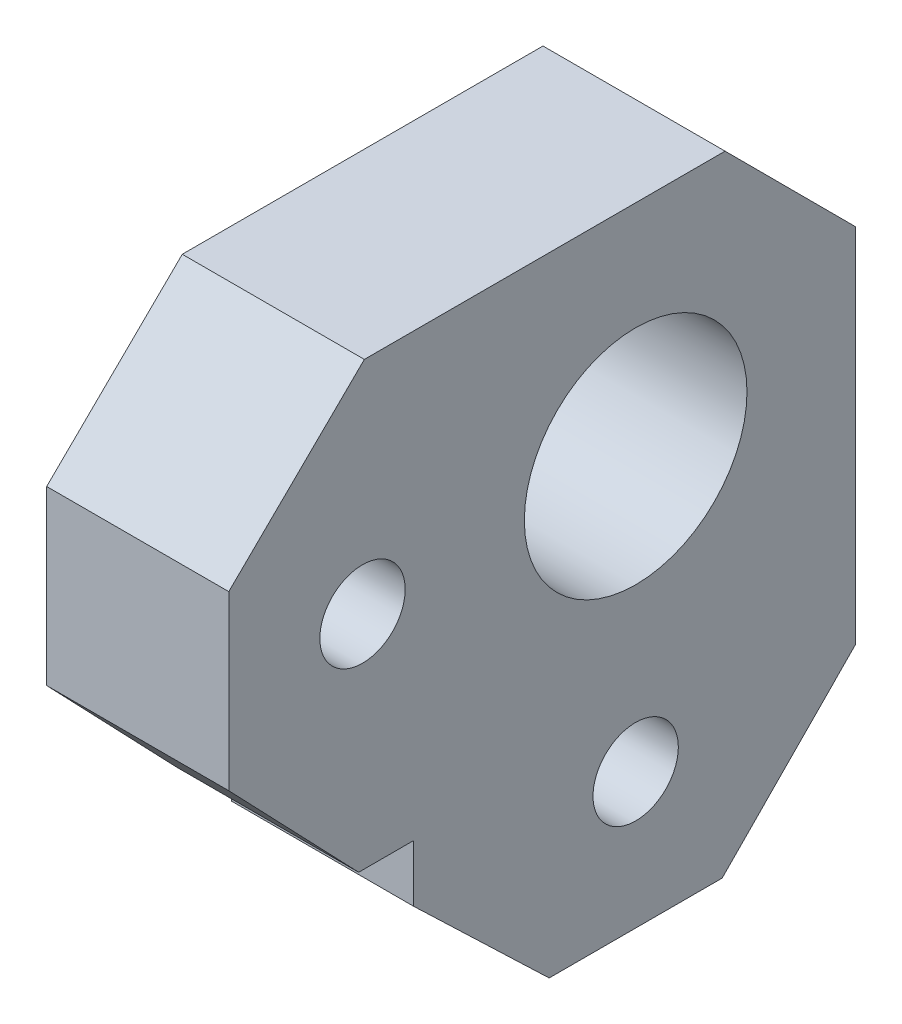
ISO-10303-21;
HEADER;
FILE_DESCRIPTION(('STEP AP214'),'2;1');
FILE_NAME('part.step','',(''),(''),'','','');
FILE_SCHEMA(('AUTOMOTIVE_DESIGN { 1 0 10303 214 1 1 1 1 }'));
ENDSEC;
DATA;
#1=APPLICATION_CONTEXT('core data for automotive mechanical design processes');
#2=APPLICATION_PROTOCOL_DEFINITION('international standard','automotive_design',2000,#1);
#3=PRODUCT_CONTEXT('',#1,'mechanical');
#4=PRODUCT('Part','Part','',(#3));
#5=PRODUCT_RELATED_PRODUCT_CATEGORY('part','',(#4));
#6=PRODUCT_DEFINITION_FORMATION('','',#4);
#7=PRODUCT_DEFINITION_CONTEXT('part definition',#1,'design');
#8=PRODUCT_DEFINITION('design','',#6,#7);
#9=PRODUCT_DEFINITION_SHAPE('','',#8);
#10=(LENGTH_UNIT() NAMED_UNIT(*) SI_UNIT(.MILLI.,.METRE.));
#11=(NAMED_UNIT(*) PLANE_ANGLE_UNIT() SI_UNIT($,.RADIAN.));
#12=(NAMED_UNIT(*) SI_UNIT($,.STERADIAN.) SOLID_ANGLE_UNIT());
#13=UNCERTAINTY_MEASURE_WITH_UNIT(LENGTH_MEASURE(1.E-05),#10,'distance_accuracy_value','');
#14=(GEOMETRIC_REPRESENTATION_CONTEXT(3) GLOBAL_UNCERTAINTY_ASSIGNED_CONTEXT((#13)) GLOBAL_UNIT_ASSIGNED_CONTEXT((#10,
#11,#12)) REPRESENTATION_CONTEXT('',''));
#15=CARTESIAN_POINT('',(0.,0.,0.));
#16=DIRECTION('',(0.,0.,1.));
#17=DIRECTION('',(1.,0.,0.));
#18=AXIS2_PLACEMENT_3D('',#15,#16,#17);
#19=CARTESIAN_POINT('',(6.4,-10.5922958261297,-9.25533229769456));
#20=DIRECTION('',(-1.,0.,0.));
#21=DIRECTION('',(0.,0.,1.));
#22=AXIS2_PLACEMENT_3D('',#19,#20,#21);
#23=PLANE('',#22);
#24=CARTESIAN_POINT('',(6.4,3.76854291252349,8.06466770230523));
#25=DIRECTION('',(1.,0.,0.));
#26=DIRECTION('',(0.,0.,-1.));
#27=AXIS2_PLACEMENT_3D('',#24,#25,#26);
#28=CIRCLE('',#27,1.5);
#29=CARTESIAN_POINT('',(6.4,3.76854291252349,6.56466770230523));
#30=VERTEX_POINT('',#29);
#31=EDGE_CURVE('E250',#30,#30,#28,.T.);
#32=ORIENTED_EDGE('',*,*,#31,.F.);
#33=EDGE_LOOP('',(#32));
#34=FACE_BOUND('',#33,.T.);
#35=DIRECTION('',(0.,0.,-1.));
#36=VECTOR('',#35,1.);
#37=CARTESIAN_POINT('',(6.4,-10.5922958261297,1.50382896365233));
#38=LINE('',#37,#36);
#39=CARTESIAN_POINT('',(6.4,-10.5922958261297,1.50382896365233));
#40=VERTEX_POINT('',#39);
#41=CARTESIAN_POINT('',(6.4,-10.5922958261297,-4.57449355904186));
#42=VERTEX_POINT('',#41);
#43=EDGE_CURVE('E181',#40,#42,#38,.T.);
#44=ORIENTED_EDGE('',*,*,#43,.T.);
#45=DIRECTION('',(0.,0.713072550553831,-0.70109024928796));
#46=VECTOR('',#45,1.);
#47=CARTESIAN_POINT('',(6.4,-5.83145708747638,-9.25533229769452));
#48=LINE('',#47,#46);
#49=CARTESIAN_POINT('',(6.4,-5.83145708747638,-9.25533229769452));
#50=VERTEX_POINT('',#49);
#51=EDGE_CURVE('E106',#42,#50,#48,.T.);
#52=ORIENTED_EDGE('',*,*,#51,.T.);
#53=DIRECTION('',(0.,1.,0.));
#54=VECTOR('',#53,1.);
#55=CARTESIAN_POINT('',(6.4,6.89856705514214,-9.25533229769444));
#56=LINE('',#55,#54);
#57=CARTESIAN_POINT('',(6.4,6.89856705514214,-9.25533229769444));
#58=VERTEX_POINT('',#57);
#59=EDGE_CURVE('E205',#50,#58,#56,.T.);
#60=ORIENTED_EDGE('',*,*,#59,.T.);
#61=DIRECTION('',(0.,0.707701273736419,0.706511788402607));
#62=VECTOR('',#61,1.);
#63=CARTESIAN_POINT('',(6.4,11.4835127905644,-4.67809281618328));
#64=LINE('',#63,#62);
#65=CARTESIAN_POINT('',(6.4,11.4835127905644,-4.67809281618328));
#66=VERTEX_POINT('',#65);
#67=EDGE_CURVE('E224',#58,#66,#64,.T.);
#68=ORIENTED_EDGE('',*,*,#67,.T.);
#69=DIRECTION('',(0.,0.,1.));
#70=VECTOR('',#69,1.);
#71=CARTESIAN_POINT('',(6.4,11.4835127905643,7.99946144350579));
#72=LINE('',#71,#70);
#73=CARTESIAN_POINT('',(6.4,11.4835127905643,7.99946144350579));
#74=VERTEX_POINT('',#73);
#75=EDGE_CURVE('E221',#66,#74,#72,.T.);
#76=ORIENTED_EDGE('',*,*,#75,.T.);
#77=DIRECTION('',(0.,-0.701095833422504,0.713067060210752));
#78=VECTOR('',#77,1.);
#79=CARTESIAN_POINT('',(6.4,11.4835127905643,7.99946144350579));
#80=LINE('',#79,#78);
#81=CARTESIAN_POINT('',(6.4,6.79830653176522,12.7646677023049));
#82=VERTEX_POINT('',#81);
#83=EDGE_CURVE('E223',#74,#82,#80,.T.);
#84=ORIENTED_EDGE('',*,*,#83,.T.);
#85=DIRECTION('',(0.,-1.,0.));
#86=VECTOR('',#85,1.);
#87=CARTESIAN_POINT('',(6.4,6.79830653176522,12.7646677023049));
#88=LINE('',#87,#86);
#89=CARTESIAN_POINT('',(6.4,0.7387792932821,12.7646677023048));
#90=VERTEX_POINT('',#89);
#91=EDGE_CURVE('E226',#82,#90,#88,.T.);
#92=ORIENTED_EDGE('',*,*,#91,.T.);
#93=DIRECTION('',(0.,-0.722097940110516,-0.691790838973855));
#94=VECTOR('',#93,1.);
#95=CARTESIAN_POINT('',(6.4,-4.0264269655171,8.19946144350611));
#96=LINE('',#95,#94);
#97=CARTESIAN_POINT('',(6.4,-4.0264269655171,8.19946144350611));
#98=VERTEX_POINT('',#97);
#99=EDGE_CURVE('E138',#90,#98,#96,.T.);
#100=ORIENTED_EDGE('',*,*,#99,.T.);
#101=DIRECTION('',(0.,0.,-1.));
#102=VECTOR('',#101,1.);
#103=CARTESIAN_POINT('',(6.4,-4.02642696551713,6.26466770230559));
#104=LINE('',#103,#102);
#105=CARTESIAN_POINT('',(6.4,-4.02642696551713,6.26466770230559));
#106=VERTEX_POINT('',#105);
#107=EDGE_CURVE('E131',#98,#106,#104,.T.);
#108=ORIENTED_EDGE('',*,*,#107,.T.);
#109=DIRECTION('',(0.,-1.,0.));
#110=VECTOR('',#109,1.);
#111=CARTESIAN_POINT('',(6.4,-6.03145708747644,6.26466770230559));
#112=LINE('',#111,#110);
#113=CARTESIAN_POINT('',(6.4,-6.03145708747644,6.26466770230559));
#114=VERTEX_POINT('',#113);
#115=EDGE_CURVE('E135',#106,#114,#112,.T.);
#116=ORIENTED_EDGE('',*,*,#115,.T.);
#117=DIRECTION('',(0.,-0.691776341224573,-0.722111829097089));
#118=VECTOR('',#117,1.);
#119=CARTESIAN_POINT('',(6.4,-10.5922958261297,1.50382896365233));
#120=LINE('',#119,#118);
#121=EDGE_CURVE('E56',#114,#40,#120,.T.);
#122=ORIENTED_EDGE('',*,*,#121,.T.);
#123=EDGE_LOOP('',(#44,#52,#60,#68,#76,#84,#92,#100,#108,#116,#122));
#124=FACE_BOUND('',#123,.T.);
#125=CARTESIAN_POINT('',(6.4,3.76854291252347,-1.53533229769476));
#126=DIRECTION('',(1.,0.,0.));
#127=DIRECTION('',(0.,0.,-1.));
#128=AXIS2_PLACEMENT_3D('',#125,#126,#127);
#129=CIRCLE('',#128,3.9125);
#130=CARTESIAN_POINT('',(6.4,3.76854291252347,-5.44783229769476));
#131=VERTEX_POINT('',#130);
#132=EDGE_CURVE('E163',#131,#131,#129,.T.);
#133=ORIENTED_EDGE('',*,*,#132,.F.);
#134=EDGE_LOOP('',(#133));
#135=FACE_BOUND('',#134,.T.);
#136=CARTESIAN_POINT('',(6.4,-5.83145708747653,-1.53533229769477));
#137=DIRECTION('',(1.,0.,0.));
#138=DIRECTION('',(0.,0.,-1.));
#139=AXIS2_PLACEMENT_3D('',#136,#137,#138);
#140=CIRCLE('',#139,1.5);
#141=CARTESIAN_POINT('',(6.4,-5.83145708747653,-3.03533229769477));
#142=VERTEX_POINT('',#141);
#143=EDGE_CURVE('E256',#142,#142,#140,.T.);
#144=ORIENTED_EDGE('',*,*,#143,.F.);
#145=EDGE_LOOP('',(#144));
#146=FACE_BOUND('',#145,.T.);
#147=ADVANCED_FACE('F32',(#34,#124,#135,#146),#23,.F.);
#148=CARTESIAN_POINT('',(0.,-10.5922958261297,-9.25533229769456));
#149=DIRECTION('',(-1.,0.,0.));
#150=DIRECTION('',(0.,0.,1.));
#151=AXIS2_PLACEMENT_3D('',#148,#149,#150);
#152=PLANE('',#151);
#153=DIRECTION('',(0.,-1.,0.));
#154=VECTOR('',#153,1.);
#155=CARTESIAN_POINT('',(0.,-2.52642696551713,3.76466770230551));
#156=LINE('',#155,#154);
#157=CARTESIAN_POINT('',(0.,-1.52642696551714,3.76466770230551));
#158=VERTEX_POINT('',#157);
#159=CARTESIAN_POINT('',(0.,-2.52642696551713,3.76466770230551));
#160=VERTEX_POINT('',#159);
#161=EDGE_CURVE('E47',#158,#160,#156,.T.);
#162=ORIENTED_EDGE('',*,*,#161,.F.);
#163=DIRECTION('',(0.,0.,-1.));
#164=VECTOR('',#163,1.);
#165=CARTESIAN_POINT('',(0.,-1.52642696551714,4.76466770230551));
#166=LINE('',#165,#164);
#167=CARTESIAN_POINT('',(0.,-1.52642696551714,4.76466770230551));
#168=VERTEX_POINT('',#167);
#169=EDGE_CURVE('E275',#168,#158,#166,.T.);
#170=ORIENTED_EDGE('',*,*,#169,.F.);
#171=DIRECTION('',(0.,1.,0.));
#172=VECTOR('',#171,1.);
#173=CARTESIAN_POINT('',(0.,-1.52642696551714,4.76466770230551));
#174=LINE('',#173,#172);
#175=CARTESIAN_POINT('',(0.,-2.52642696551713,4.76466770230551));
#176=VERTEX_POINT('',#175);
#177=EDGE_CURVE('E279',#176,#168,#174,.T.);
#178=ORIENTED_EDGE('',*,*,#177,.F.);
#179=DIRECTION('',(0.,0.,1.));
#180=VECTOR('',#179,1.);
#181=CARTESIAN_POINT('',(0.,-2.52642696551713,4.76466770230551));
#182=LINE('',#181,#180);
#183=EDGE_CURVE('E282',#160,#176,#182,.T.);
#184=ORIENTED_EDGE('',*,*,#183,.F.);
#185=EDGE_LOOP('',(#162,#170,#178,#184));
#186=FACE_BOUND('',#185,.T.);
#187=CARTESIAN_POINT('',(0.,3.76854291252349,8.06466770230523));
#188=DIRECTION('',(1.,0.,0.));
#189=DIRECTION('',(0.,0.,-1.));
#190=AXIS2_PLACEMENT_3D('',#187,#188,#189);
#191=CIRCLE('',#190,1.5);
#192=CARTESIAN_POINT('',(0.,3.76854291252349,6.56466770230523));
#193=VERTEX_POINT('',#192);
#194=EDGE_CURVE('E253',#193,#193,#191,.T.);
#195=ORIENTED_EDGE('',*,*,#194,.T.);
#196=EDGE_LOOP('',(#195));
#197=FACE_BOUND('',#196,.T.);
#198=DIRECTION('',(0.,0.,-1.));
#199=VECTOR('',#198,1.);
#200=CARTESIAN_POINT('',(0.,-10.5922958261297,1.50382896365233));
#201=LINE('',#200,#199);
#202=CARTESIAN_POINT('',(0.,-10.5922958261297,1.50382896365233));
#203=VERTEX_POINT('',#202);
#204=CARTESIAN_POINT('',(0.,-10.5922958261297,-4.57449355904186));
#205=VERTEX_POINT('',#204);
#206=EDGE_CURVE('E159',#203,#205,#201,.T.);
#207=ORIENTED_EDGE('',*,*,#206,.F.);
#208=DIRECTION('',(0.,-0.691776341224573,-0.722111829097089));
#209=VECTOR('',#208,1.);
#210=CARTESIAN_POINT('',(0.,-10.5922958261297,1.50382896365233));
#211=LINE('',#210,#209);
#212=CARTESIAN_POINT('',(0.,-6.03145708747644,6.26466770230559));
#213=VERTEX_POINT('',#212);
#214=EDGE_CURVE('E98',#213,#203,#211,.T.);
#215=ORIENTED_EDGE('',*,*,#214,.F.);
#216=DIRECTION('',(0.,-1.,0.));
#217=VECTOR('',#216,1.);
#218=CARTESIAN_POINT('',(0.,-6.03145708747644,6.26466770230559));
#219=LINE('',#218,#217);
#220=CARTESIAN_POINT('',(0.,-4.02642696551713,6.26466770230559));
#221=VERTEX_POINT('',#220);
#222=EDGE_CURVE('E178',#221,#213,#219,.T.);
#223=ORIENTED_EDGE('',*,*,#222,.F.);
#224=DIRECTION('',(0.,0.,-1.));
#225=VECTOR('',#224,1.);
#226=CARTESIAN_POINT('',(0.,-4.02642696551713,6.26466770230559));
#227=LINE('',#226,#225);
#228=CARTESIAN_POINT('',(0.,-4.0264269655171,8.19946144350611));
#229=VERTEX_POINT('',#228);
#230=EDGE_CURVE('E147',#229,#221,#227,.T.);
#231=ORIENTED_EDGE('',*,*,#230,.F.);
#232=DIRECTION('',(0.,-0.722097940110516,-0.691790838973855));
#233=VECTOR('',#232,1.);
#234=CARTESIAN_POINT('',(0.,-4.0264269655171,8.19946144350611));
#235=LINE('',#234,#233);
#236=CARTESIAN_POINT('',(0.,0.7387792932821,12.7646677023048));
#237=VERTEX_POINT('',#236);
#238=EDGE_CURVE('E175',#237,#229,#235,.T.);
#239=ORIENTED_EDGE('',*,*,#238,.F.);
#240=DIRECTION('',(0.,-1.,0.));
#241=VECTOR('',#240,1.);
#242=CARTESIAN_POINT('',(0.,6.79830653176522,12.7646677023049));
#243=LINE('',#242,#241);
#244=CARTESIAN_POINT('',(0.,6.79830653176522,12.7646677023049));
#245=VERTEX_POINT('',#244);
#246=EDGE_CURVE('E173',#245,#237,#243,.T.);
#247=ORIENTED_EDGE('',*,*,#246,.F.);
#248=DIRECTION('',(0.,-0.701095833422504,0.713067060210752));
#249=VECTOR('',#248,1.);
#250=CARTESIAN_POINT('',(0.,11.4835127905643,7.99946144350579));
#251=LINE('',#250,#249);
#252=CARTESIAN_POINT('',(0.,11.4835127905643,7.99946144350579));
#253=VERTEX_POINT('',#252);
#254=EDGE_CURVE('E171',#253,#245,#251,.T.);
#255=ORIENTED_EDGE('',*,*,#254,.F.);
#256=DIRECTION('',(0.,0.,1.));
#257=VECTOR('',#256,1.);
#258=CARTESIAN_POINT('',(0.,11.4835127905643,7.99946144350579));
#259=LINE('',#258,#257);
#260=CARTESIAN_POINT('',(0.,11.4835127905644,-4.67809281618328));
#261=VERTEX_POINT('',#260);
#262=EDGE_CURVE('E169',#261,#253,#259,.T.);
#263=ORIENTED_EDGE('',*,*,#262,.F.);
#264=DIRECTION('',(0.,0.707701273736419,0.706511788402607));
#265=VECTOR('',#264,1.);
#266=CARTESIAN_POINT('',(0.,11.4835127905644,-4.67809281618328));
#267=LINE('',#266,#265);
#268=CARTESIAN_POINT('',(0.,6.89856705514214,-9.25533229769444));
#269=VERTEX_POINT('',#268);
#270=EDGE_CURVE('E167',#269,#261,#267,.T.);
#271=ORIENTED_EDGE('',*,*,#270,.F.);
#272=DIRECTION('',(0.,1.,0.));
#273=VECTOR('',#272,1.);
#274=CARTESIAN_POINT('',(0.,6.89856705514214,-9.25533229769444));
#275=LINE('',#274,#273);
#276=CARTESIAN_POINT('',(0.,-5.83145708747638,-9.25533229769452));
#277=VERTEX_POINT('',#276);
#278=EDGE_CURVE('E165',#277,#269,#275,.T.);
#279=ORIENTED_EDGE('',*,*,#278,.F.);
#280=DIRECTION('',(0.,0.713072550553831,-0.70109024928796));
#281=VECTOR('',#280,1.);
#282=CARTESIAN_POINT('',(0.,-5.83145708747638,-9.25533229769452));
#283=LINE('',#282,#281);
#284=EDGE_CURVE('E162',#205,#277,#283,.T.);
#285=ORIENTED_EDGE('',*,*,#284,.F.);
#286=EDGE_LOOP('',(#207,#215,#223,#231,#239,#247,#255,#263,#271,#279,#285));
#287=FACE_BOUND('',#286,.T.);
#288=CARTESIAN_POINT('',(0.,3.76854291252347,-1.53533229769476));
#289=DIRECTION('',(1.,0.,0.));
#290=DIRECTION('',(0.,0.,-1.));
#291=AXIS2_PLACEMENT_3D('',#288,#289,#290);
#292=CIRCLE('',#291,3.9125);
#293=CARTESIAN_POINT('',(0.,3.76854291252347,-5.44783229769476));
#294=VERTEX_POINT('',#293);
#295=EDGE_CURVE('E247',#294,#294,#292,.T.);
#296=ORIENTED_EDGE('',*,*,#295,.T.);
#297=EDGE_LOOP('',(#296));
#298=FACE_BOUND('',#297,.T.);
#299=CARTESIAN_POINT('',(0.,-5.83145708747653,-1.53533229769477));
#300=DIRECTION('',(1.,0.,0.));
#301=DIRECTION('',(0.,0.,-1.));
#302=AXIS2_PLACEMENT_3D('',#299,#300,#301);
#303=CIRCLE('',#302,1.5);
#304=CARTESIAN_POINT('',(0.,-5.83145708747653,-3.03533229769477));
#305=VERTEX_POINT('',#304);
#306=EDGE_CURVE('E259',#305,#305,#303,.T.);
#307=ORIENTED_EDGE('',*,*,#306,.T.);
#308=EDGE_LOOP('',(#307));
#309=FACE_BOUND('',#308,.T.);
#310=ADVANCED_FACE('F209',(#186,#197,#287,#298,#309),#152,.T.);
#311=CARTESIAN_POINT('',(6.4,-10.5922958261297,1.50382896365233));
#312=DIRECTION('',(0.,1.,0.));
#313=DIRECTION('',(0.,0.,1.));
#314=AXIS2_PLACEMENT_3D('',#311,#312,#313);
#315=PLANE('',#314);
#316=ORIENTED_EDGE('',*,*,#206,.T.);
#317=DIRECTION('',(-1.,0.,0.));
#318=VECTOR('',#317,1.);
#319=CARTESIAN_POINT('',(6.4,-10.5922958261297,-4.57449355904186));
#320=LINE('',#319,#318);
#321=EDGE_CURVE('E11',#42,#205,#320,.T.);
#322=ORIENTED_EDGE('',*,*,#321,.F.);
#323=ORIENTED_EDGE('',*,*,#43,.F.);
#324=DIRECTION('',(-1.,0.,0.));
#325=VECTOR('',#324,1.);
#326=CARTESIAN_POINT('',(6.4,-10.5922958261297,1.50382896365233));
#327=LINE('',#326,#325);
#328=EDGE_CURVE('E155',#40,#203,#327,.T.);
#329=ORIENTED_EDGE('',*,*,#328,.T.);
#330=EDGE_LOOP('',(#316,#322,#323,#329));
#331=FACE_BOUND('',#330,.T.);
#332=ADVANCED_FACE('F34',(#331),#315,.F.);
#333=CARTESIAN_POINT('',(6.4,-5.83145708747638,-9.25533229769452));
#334=DIRECTION('',(0.,0.70109024928796,0.713072550553831));
#335=DIRECTION('',(0.,-0.713072550553831,0.70109024928796));
#336=AXIS2_PLACEMENT_3D('',#333,#334,#335);
#337=PLANE('',#336);
#338=ORIENTED_EDGE('',*,*,#284,.T.);
#339=DIRECTION('',(-1.,0.,0.));
#340=VECTOR('',#339,1.);
#341=CARTESIAN_POINT('',(6.4,-5.83145708747638,-9.25533229769452));
#342=LINE('',#341,#340);
#343=EDGE_CURVE('E40',#50,#277,#342,.T.);
#344=ORIENTED_EDGE('',*,*,#343,.F.);
#345=ORIENTED_EDGE('',*,*,#51,.F.);
#346=ORIENTED_EDGE('',*,*,#321,.T.);
#347=EDGE_LOOP('',(#338,#344,#345,#346));
#348=FACE_BOUND('',#347,.T.);
#349=ADVANCED_FACE('F366',(#348),#337,.F.);
#350=CARTESIAN_POINT('',(6.4,6.89856705514214,-9.25533229769444));
#351=DIRECTION('',(0.,0.,1.));
#352=DIRECTION('',(0.,-1.,0.));
#353=AXIS2_PLACEMENT_3D('',#350,#351,#352);
#354=PLANE('',#353);
#355=ORIENTED_EDGE('',*,*,#278,.T.);
#356=DIRECTION('',(-1.,0.,0.));
#357=VECTOR('',#356,1.);
#358=CARTESIAN_POINT('',(6.4,6.89856705514214,-9.25533229769444));
#359=LINE('',#358,#357);
#360=EDGE_CURVE('E197',#58,#269,#359,.T.);
#361=ORIENTED_EDGE('',*,*,#360,.F.);
#362=ORIENTED_EDGE('',*,*,#59,.F.);
#363=ORIENTED_EDGE('',*,*,#343,.T.);
#364=EDGE_LOOP('',(#355,#361,#362,#363));
#365=FACE_BOUND('',#364,.T.);
#366=ADVANCED_FACE('F203',(#365),#354,.F.);
#367=CARTESIAN_POINT('',(6.4,11.4835127905644,-4.67809281618328));
#368=DIRECTION('',(0.,-0.706511788402607,0.707701273736419));
#369=DIRECTION('',(0.,-0.707701273736419,-0.706511788402607));
#370=AXIS2_PLACEMENT_3D('',#367,#368,#369);
#371=PLANE('',#370);
#372=ORIENTED_EDGE('',*,*,#270,.T.);
#373=DIRECTION('',(-1.,0.,0.));
#374=VECTOR('',#373,1.);
#375=CARTESIAN_POINT('',(6.4,11.4835127905644,-4.67809281618328));
#376=LINE('',#375,#374);
#377=EDGE_CURVE('E194',#66,#261,#376,.T.);
#378=ORIENTED_EDGE('',*,*,#377,.F.);
#379=ORIENTED_EDGE('',*,*,#67,.F.);
#380=ORIENTED_EDGE('',*,*,#360,.T.);
#381=EDGE_LOOP('',(#372,#378,#379,#380));
#382=FACE_BOUND('',#381,.T.);
#383=ADVANCED_FACE('F215',(#382),#371,.F.);
#384=CARTESIAN_POINT('',(6.4,11.4835127905643,7.99946144350579));
#385=DIRECTION('',(0.,-1.,0.));
#386=DIRECTION('',(0.,0.,-1.));
#387=AXIS2_PLACEMENT_3D('',#384,#385,#386);
#388=PLANE('',#387);
#389=ORIENTED_EDGE('',*,*,#262,.T.);
#390=DIRECTION('',(-1.,0.,0.));
#391=VECTOR('',#390,1.);
#392=CARTESIAN_POINT('',(6.4,11.4835127905643,7.99946144350579));
#393=LINE('',#392,#391);
#394=EDGE_CURVE('E191',#74,#253,#393,.T.);
#395=ORIENTED_EDGE('',*,*,#394,.F.);
#396=ORIENTED_EDGE('',*,*,#75,.F.);
#397=ORIENTED_EDGE('',*,*,#377,.T.);
#398=EDGE_LOOP('',(#389,#395,#396,#397));
#399=FACE_BOUND('',#398,.T.);
#400=ADVANCED_FACE('F219',(#399),#388,.F.);
#401=CARTESIAN_POINT('',(6.4,11.4835127905643,7.99946144350579));
#402=DIRECTION('',(0.,-0.713067060210752,-0.701095833422504));
#403=DIRECTION('',(0.,0.701095833422504,-0.713067060210752));
#404=AXIS2_PLACEMENT_3D('',#401,#402,#403);
#405=PLANE('',#404);
#406=ORIENTED_EDGE('',*,*,#254,.T.);
#407=DIRECTION('',(-1.,0.,0.));
#408=VECTOR('',#407,1.);
#409=CARTESIAN_POINT('',(6.4,6.79830653176522,12.7646677023049));
#410=LINE('',#409,#408);
#411=EDGE_CURVE('E188',#82,#245,#410,.T.);
#412=ORIENTED_EDGE('',*,*,#411,.F.);
#413=ORIENTED_EDGE('',*,*,#83,.F.);
#414=ORIENTED_EDGE('',*,*,#394,.T.);
#415=EDGE_LOOP('',(#406,#412,#413,#414));
#416=FACE_BOUND('',#415,.T.);
#417=ADVANCED_FACE('F357',(#416),#405,.F.);
#418=CARTESIAN_POINT('',(6.4,6.79830653176522,12.7646677023049));
#419=DIRECTION('',(0.,0.,-1.));
#420=DIRECTION('',(0.,1.,0.));
#421=AXIS2_PLACEMENT_3D('',#418,#419,#420);
#422=PLANE('',#421);
#423=ORIENTED_EDGE('',*,*,#246,.T.);
#424=DIRECTION('',(-1.,0.,0.));
#425=VECTOR('',#424,1.);
#426=CARTESIAN_POINT('',(6.4,0.7387792932821,12.7646677023048));
#427=LINE('',#426,#425);
#428=EDGE_CURVE('E185',#90,#237,#427,.T.);
#429=ORIENTED_EDGE('',*,*,#428,.F.);
#430=ORIENTED_EDGE('',*,*,#91,.F.);
#431=ORIENTED_EDGE('',*,*,#411,.T.);
#432=EDGE_LOOP('',(#423,#429,#430,#431));
#433=FACE_BOUND('',#432,.T.);
#434=ADVANCED_FACE('F235',(#433),#422,.F.);
#435=CARTESIAN_POINT('',(6.4,-4.0264269655171,8.19946144350611));
#436=DIRECTION('',(0.,0.691790838973854,-0.722097940110516));
#437=DIRECTION('',(0.,0.722097940110516,0.691790838973854));
#438=AXIS2_PLACEMENT_3D('',#435,#436,#437);
#439=PLANE('',#438);
#440=ORIENTED_EDGE('',*,*,#238,.T.);
#441=DIRECTION('',(-1.,0.,0.));
#442=VECTOR('',#441,1.);
#443=CARTESIAN_POINT('',(6.4,-4.0264269655171,8.19946144350611));
#444=LINE('',#443,#442);
#445=EDGE_CURVE('E150',#98,#229,#444,.T.);
#446=ORIENTED_EDGE('',*,*,#445,.F.);
#447=ORIENTED_EDGE('',*,*,#99,.F.);
#448=ORIENTED_EDGE('',*,*,#428,.T.);
#449=EDGE_LOOP('',(#440,#446,#447,#448));
#450=FACE_BOUND('',#449,.T.);
#451=ADVANCED_FACE('F239',(#450),#439,.F.);
#452=CARTESIAN_POINT('',(6.4,-4.02642696551713,6.26466770230559));
#453=DIRECTION('',(0.,1.,0.));
#454=DIRECTION('',(0.,0.,1.));
#455=AXIS2_PLACEMENT_3D('',#452,#453,#454);
#456=PLANE('',#455);
#457=ORIENTED_EDGE('',*,*,#230,.T.);
#458=DIRECTION('',(-1.,0.,0.));
#459=VECTOR('',#458,1.);
#460=CARTESIAN_POINT('',(6.4,-4.02642696551713,6.26466770230559));
#461=LINE('',#460,#459);
#462=EDGE_CURVE('E144',#106,#221,#461,.T.);
#463=ORIENTED_EDGE('',*,*,#462,.F.);
#464=ORIENTED_EDGE('',*,*,#107,.F.);
#465=ORIENTED_EDGE('',*,*,#445,.T.);
#466=EDGE_LOOP('',(#457,#463,#464,#465));
#467=FACE_BOUND('',#466,.T.);
#468=ADVANCED_FACE('F145',(#467),#456,.F.);
#469=CARTESIAN_POINT('',(6.4,-6.03145708747644,6.26466770230559));
#470=DIRECTION('',(0.,0.,-1.));
#471=DIRECTION('',(-1.,0.,0.));
#472=AXIS2_PLACEMENT_3D('',#469,#470,#471);
#473=PLANE('',#472);
#474=ORIENTED_EDGE('',*,*,#222,.T.);
#475=DIRECTION('',(-1.,0.,0.));
#476=VECTOR('',#475,1.);
#477=CARTESIAN_POINT('',(6.4,-6.03145708747644,6.26466770230559));
#478=LINE('',#477,#476);
#479=EDGE_CURVE('E151',#114,#213,#478,.T.);
#480=ORIENTED_EDGE('',*,*,#479,.F.);
#481=ORIENTED_EDGE('',*,*,#115,.F.);
#482=ORIENTED_EDGE('',*,*,#462,.T.);
#483=EDGE_LOOP('',(#474,#480,#481,#482));
#484=FACE_BOUND('',#483,.T.);
#485=ADVANCED_FACE('F153',(#484),#473,.F.);
#486=CARTESIAN_POINT('',(6.4,-10.5922958261297,1.50382896365233));
#487=DIRECTION('',(0.,0.722111829097089,-0.691776341224573));
#488=DIRECTION('',(0.,0.691776341224573,0.722111829097089));
#489=AXIS2_PLACEMENT_3D('',#486,#487,#488);
#490=PLANE('',#489);
#491=ORIENTED_EDGE('',*,*,#214,.T.);
#492=ORIENTED_EDGE('',*,*,#328,.F.);
#493=ORIENTED_EDGE('',*,*,#121,.F.);
#494=ORIENTED_EDGE('',*,*,#479,.T.);
#495=EDGE_LOOP('',(#491,#492,#493,#494));
#496=FACE_BOUND('',#495,.T.);
#497=ADVANCED_FACE('F240',(#496),#490,.F.);
#498=CARTESIAN_POINT('',(6.4,3.76854291252347,-1.53533229769476));
#499=DIRECTION('',(-1.,0.,0.));
#500=DIRECTION('',(0.,0.,1.));
#501=AXIS2_PLACEMENT_3D('',#498,#499,#500);
#502=CYLINDRICAL_SURFACE('',#501,3.9125);
#503=ORIENTED_EDGE('',*,*,#132,.T.);
#504=EDGE_LOOP('',(#503));
#505=FACE_BOUND('',#504,.T.);
#506=ORIENTED_EDGE('',*,*,#295,.F.);
#507=EDGE_LOOP('',(#506));
#508=FACE_BOUND('',#507,.T.);
#509=ADVANCED_FACE('F344',(#505,#508),#502,.F.);
#510=CARTESIAN_POINT('',(6.4,3.76854291252349,8.06466770230523));
#511=DIRECTION('',(-1.,0.,0.));
#512=DIRECTION('',(0.,0.,1.));
#513=AXIS2_PLACEMENT_3D('',#510,#511,#512);
#514=CYLINDRICAL_SURFACE('',#513,1.5);
#515=ORIENTED_EDGE('',*,*,#31,.T.);
#516=EDGE_LOOP('',(#515));
#517=FACE_BOUND('',#516,.T.);
#518=ORIENTED_EDGE('',*,*,#194,.F.);
#519=EDGE_LOOP('',(#518));
#520=FACE_BOUND('',#519,.T.);
#521=ADVANCED_FACE('F421',(#517,#520),#514,.F.);
#522=CARTESIAN_POINT('',(6.4,-5.83145708747653,-1.53533229769477));
#523=DIRECTION('',(-1.,0.,0.));
#524=DIRECTION('',(0.,0.,1.));
#525=AXIS2_PLACEMENT_3D('',#522,#523,#524);
#526=CYLINDRICAL_SURFACE('',#525,1.5);
#527=ORIENTED_EDGE('',*,*,#143,.T.);
#528=EDGE_LOOP('',(#527));
#529=FACE_BOUND('',#528,.T.);
#530=ORIENTED_EDGE('',*,*,#306,.F.);
#531=EDGE_LOOP('',(#530));
#532=FACE_BOUND('',#531,.T.);
#533=ADVANCED_FACE('F384',(#529,#532),#526,.F.);
#534=CARTESIAN_POINT('',(0.01,-2.52642696551713,3.76466770230551));
#535=DIRECTION('',(0.,0.,-1.));
#536=DIRECTION('',(-1.,0.,0.));
#537=AXIS2_PLACEMENT_3D('',#534,#535,#536);
#538=PLANE('',#537);
#539=ORIENTED_EDGE('',*,*,#161,.T.);
#540=DIRECTION('',(-1.,0.,0.));
#541=VECTOR('',#540,1.);
#542=CARTESIAN_POINT('',(0.01,-2.52642696551713,3.76466770230551));
#543=LINE('',#542,#541);
#544=CARTESIAN_POINT('',(0.01,-2.52642696551713,3.76466770230551));
#545=VERTEX_POINT('',#544);
#546=EDGE_CURVE('E265',#545,#160,#543,.T.);
#547=ORIENTED_EDGE('',*,*,#546,.F.);
#548=DIRECTION('',(0.,-1.,0.));
#549=VECTOR('',#548,1.);
#550=CARTESIAN_POINT('',(0.01,-2.52642696551713,3.76466770230551));
#551=LINE('',#550,#549);
#552=CARTESIAN_POINT('',(0.01,-1.52642696551714,3.76466770230551));
#553=VERTEX_POINT('',#552);
#554=EDGE_CURVE('E278',#553,#545,#551,.T.);
#555=ORIENTED_EDGE('',*,*,#554,.F.);
#556=DIRECTION('',(-1.,0.,0.));
#557=VECTOR('',#556,1.);
#558=CARTESIAN_POINT('',(0.01,-1.52642696551714,3.76466770230551));
#559=LINE('',#558,#557);
#560=EDGE_CURVE('E262',#553,#158,#559,.T.);
#561=ORIENTED_EDGE('',*,*,#560,.T.);
#562=EDGE_LOOP('',(#539,#547,#555,#561));
#563=FACE_BOUND('',#562,.T.);
#564=ADVANCED_FACE('F303',(#563),#538,.F.);
#565=CARTESIAN_POINT('',(0.01,-1.52642696551714,4.76466770230551));
#566=DIRECTION('',(0.,1.,0.));
#567=DIRECTION('',(0.,0.,1.));
#568=AXIS2_PLACEMENT_3D('',#565,#566,#567);
#569=PLANE('',#568);
#570=ORIENTED_EDGE('',*,*,#169,.T.);
#571=ORIENTED_EDGE('',*,*,#560,.F.);
#572=DIRECTION('',(0.,0.,-1.));
#573=VECTOR('',#572,1.);
#574=CARTESIAN_POINT('',(0.01,-1.52642696551714,4.76466770230551));
#575=LINE('',#574,#573);
#576=CARTESIAN_POINT('',(0.01,-1.52642696551714,4.76466770230551));
#577=VERTEX_POINT('',#576);
#578=EDGE_CURVE('E268',#577,#553,#575,.T.);
#579=ORIENTED_EDGE('',*,*,#578,.F.);
#580=DIRECTION('',(-1.,0.,0.));
#581=VECTOR('',#580,1.);
#582=CARTESIAN_POINT('',(0.01,-1.52642696551714,4.76466770230551));
#583=LINE('',#582,#581);
#584=EDGE_CURVE('E271',#577,#168,#583,.T.);
#585=ORIENTED_EDGE('',*,*,#584,.T.);
#586=EDGE_LOOP('',(#570,#571,#579,#585));
#587=FACE_BOUND('',#586,.T.);
#588=ADVANCED_FACE('F314',(#587),#569,.F.);
#589=CARTESIAN_POINT('',(0.01,-1.52642696551714,4.76466770230551));
#590=DIRECTION('',(0.,0.,1.));
#591=DIRECTION('',(1.,0.,0.));
#592=AXIS2_PLACEMENT_3D('',#589,#590,#591);
#593=PLANE('',#592);
#594=ORIENTED_EDGE('',*,*,#177,.T.);
#595=ORIENTED_EDGE('',*,*,#584,.F.);
#596=DIRECTION('',(0.,1.,0.));
#597=VECTOR('',#596,1.);
#598=CARTESIAN_POINT('',(0.01,-1.52642696551714,4.76466770230551));
#599=LINE('',#598,#597);
#600=CARTESIAN_POINT('',(0.01,-2.52642696551713,4.76466770230551));
#601=VERTEX_POINT('',#600);
#602=EDGE_CURVE('E288',#601,#577,#599,.T.);
#603=ORIENTED_EDGE('',*,*,#602,.F.);
#604=DIRECTION('',(-1.,0.,0.));
#605=VECTOR('',#604,1.);
#606=CARTESIAN_POINT('',(0.01,-2.52642696551713,4.76466770230551));
#607=LINE('',#606,#605);
#608=EDGE_CURVE('E267',#601,#176,#607,.T.);
#609=ORIENTED_EDGE('',*,*,#608,.T.);
#610=EDGE_LOOP('',(#594,#595,#603,#609));
#611=FACE_BOUND('',#610,.T.);
#612=ADVANCED_FACE('F319',(#611),#593,.F.);
#613=CARTESIAN_POINT('',(0.01,-2.52642696551713,4.76466770230551));
#614=DIRECTION('',(0.,-1.,0.));
#615=DIRECTION('',(0.,0.,-1.));
#616=AXIS2_PLACEMENT_3D('',#613,#614,#615);
#617=PLANE('',#616);
#618=ORIENTED_EDGE('',*,*,#183,.T.);
#619=ORIENTED_EDGE('',*,*,#608,.F.);
#620=DIRECTION('',(0.,0.,1.));
#621=VECTOR('',#620,1.);
#622=CARTESIAN_POINT('',(0.01,-2.52642696551713,4.76466770230551));
#623=LINE('',#622,#621);
#624=EDGE_CURVE('E291',#545,#601,#623,.T.);
#625=ORIENTED_EDGE('',*,*,#624,.F.);
#626=ORIENTED_EDGE('',*,*,#546,.T.);
#627=EDGE_LOOP('',(#618,#619,#625,#626));
#628=FACE_BOUND('',#627,.T.);
#629=ADVANCED_FACE('F325',(#628),#617,.F.);
#630=CARTESIAN_POINT('',(0.01,-1.52642696551714,3.76466770230551));
#631=DIRECTION('',(-1.,0.,0.));
#632=DIRECTION('',(0.,0.,1.));
#633=AXIS2_PLACEMENT_3D('',#630,#631,#632);
#634=PLANE('',#633);
#635=ORIENTED_EDGE('',*,*,#554,.T.);
#636=ORIENTED_EDGE('',*,*,#624,.T.);
#637=ORIENTED_EDGE('',*,*,#602,.T.);
#638=ORIENTED_EDGE('',*,*,#578,.T.);
#639=EDGE_LOOP('',(#635,#636,#637,#638));
#640=FACE_BOUND('',#639,.T.);
#641=ADVANCED_FACE('F298',(#640),#634,.T.);
#642=CLOSED_SHELL('',(#147,#310,#332,#349,#366,#383,#400,#417,#434,#451,#468,#485,#497,#509,
#521,#533,#564,#588,#612,#629,#641));
#643=MANIFOLD_SOLID_BREP('B2',#642);
#644=ADVANCED_BREP_SHAPE_REPRESENTATION('',(#18,#643),#14);
#645=SHAPE_DEFINITION_REPRESENTATION(#9,#644);
ENDSEC;
END-ISO-10303-21;
